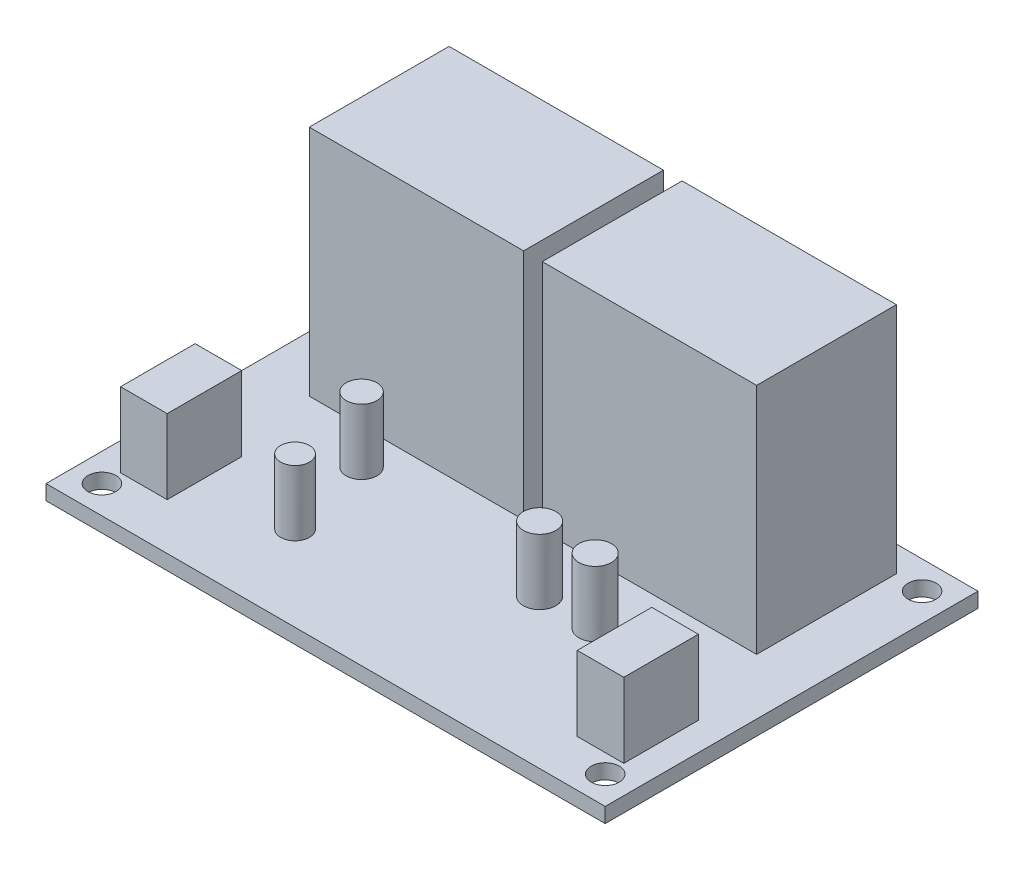
ISO-10303-21;
HEADER;
FILE_DESCRIPTION(('STEP AP214'),'2;1');
FILE_NAME('part.step','',(''),(''),'','','');
FILE_SCHEMA(('AUTOMOTIVE_DESIGN { 1 0 10303 214 1 1 1 1 }'));
ENDSEC;
DATA;
#1=APPLICATION_CONTEXT('core data for automotive mechanical design processes');
#2=APPLICATION_PROTOCOL_DEFINITION('international standard','automotive_design',2000,#1);
#3=PRODUCT_CONTEXT('',#1,'mechanical');
#4=PRODUCT('Part','Part','',(#3));
#5=PRODUCT_RELATED_PRODUCT_CATEGORY('part','',(#4));
#6=PRODUCT_DEFINITION_FORMATION('','',#4);
#7=PRODUCT_DEFINITION_CONTEXT('part definition',#1,'design');
#8=PRODUCT_DEFINITION('design','',#6,#7);
#9=PRODUCT_DEFINITION_SHAPE('','',#8);
#10=(LENGTH_UNIT() NAMED_UNIT(*) SI_UNIT(.MILLI.,.METRE.));
#11=(NAMED_UNIT(*) PLANE_ANGLE_UNIT() SI_UNIT($,.RADIAN.));
#12=(NAMED_UNIT(*) SI_UNIT($,.STERADIAN.) SOLID_ANGLE_UNIT());
#13=UNCERTAINTY_MEASURE_WITH_UNIT(LENGTH_MEASURE(1.E-05),#10,'distance_accuracy_value','');
#14=(GEOMETRIC_REPRESENTATION_CONTEXT(3) GLOBAL_UNCERTAINTY_ASSIGNED_CONTEXT((#13)) GLOBAL_UNIT_ASSIGNED_CONTEXT((#10,
#11,#12)) REPRESENTATION_CONTEXT('',''));
#15=CARTESIAN_POINT('',(0.,0.,0.));
#16=DIRECTION('',(0.,0.,1.));
#17=DIRECTION('',(1.,0.,0.));
#18=AXIS2_PLACEMENT_3D('',#15,#16,#17);
#19=CARTESIAN_POINT('',(0.,1.6,0.));
#20=DIRECTION('',(0.,-1.,0.));
#21=DIRECTION('',(0.,0.,-1.));
#22=AXIS2_PLACEMENT_3D('',#19,#20,#21);
#23=PLANE('',#22);
#24=CARTESIAN_POINT('',(27.,1.6,-17.));
#25=DIRECTION('',(0.,1.,0.));
#26=DIRECTION('',(0.,0.,1.));
#27=AXIS2_PLACEMENT_3D('',#24,#25,#26);
#28=CIRCLE('',#27,1.5);
#29=CARTESIAN_POINT('',(27.,1.6,-15.5));
#30=VERTEX_POINT('',#29);
#31=EDGE_CURVE('E383',#30,#30,#28,.T.);
#32=ORIENTED_EDGE('',*,*,#31,.F.);
#33=EDGE_LOOP('',(#32));
#34=FACE_BOUND('',#33,.T.);
#35=CARTESIAN_POINT('',(27.,1.6,17.));
#36=DIRECTION('',(0.,1.,0.));
#37=DIRECTION('',(0.,0.,1.));
#38=AXIS2_PLACEMENT_3D('',#35,#36,#37);
#39=CIRCLE('',#38,1.5);
#40=CARTESIAN_POINT('',(27.,1.6,18.5));
#41=VERTEX_POINT('',#40);
#42=EDGE_CURVE('E389',#41,#41,#39,.T.);
#43=ORIENTED_EDGE('',*,*,#42,.F.);
#44=EDGE_LOOP('',(#43));
#45=FACE_BOUND('',#44,.T.);
#46=CARTESIAN_POINT('',(-27.,1.6,17.));
#47=DIRECTION('',(0.,1.,0.));
#48=DIRECTION('',(0.,0.,1.));
#49=AXIS2_PLACEMENT_3D('',#46,#47,#48);
#50=CIRCLE('',#49,1.5);
#51=CARTESIAN_POINT('',(-27.,1.6,18.5));
#52=VERTEX_POINT('',#51);
#53=EDGE_CURVE('E377',#52,#52,#50,.T.);
#54=ORIENTED_EDGE('',*,*,#53,.F.);
#55=EDGE_LOOP('',(#54));
#56=FACE_BOUND('',#55,.T.);
#57=CARTESIAN_POINT('',(-27.,1.6,-17.));
#58=DIRECTION('',(0.,1.,0.));
#59=DIRECTION('',(0.,0.,1.));
#60=AXIS2_PLACEMENT_3D('',#57,#58,#59);
#61=CIRCLE('',#60,1.5);
#62=CARTESIAN_POINT('',(-27.,1.6,-15.5));
#63=VERTEX_POINT('',#62);
#64=EDGE_CURVE('E373',#63,#63,#61,.T.);
#65=ORIENTED_EDGE('',*,*,#64,.F.);
#66=EDGE_LOOP('',(#65));
#67=FACE_BOUND('',#66,.T.);
#68=CARTESIAN_POINT('',(12.9238759452155,1.6,3.99818904659685));
#69=DIRECTION('',(0.,-1.,0.));
#70=DIRECTION('',(0.,0.,-1.));
#71=AXIS2_PLACEMENT_3D('',#68,#69,#70);
#72=CIRCLE('',#71,1.75);
#73=CARTESIAN_POINT('',(12.9238759452155,1.6,2.24818904659685));
#74=VERTEX_POINT('',#73);
#75=EDGE_CURVE('E11',#74,#74,#72,.F.);
#76=ORIENTED_EDGE('',*,*,#75,.F.);
#77=EDGE_LOOP('',(#76));
#78=FACE_BOUND('',#77,.T.);
#79=CARTESIAN_POINT('',(-12.4051919607922,1.6,10.8707518402065));
#80=DIRECTION('',(0.,-1.,0.));
#81=DIRECTION('',(0.,0.,-1.));
#82=AXIS2_PLACEMENT_3D('',#79,#80,#81);
#83=CIRCLE('',#82,1.54641686401478);
#84=CARTESIAN_POINT('',(-12.4051919607922,1.6,9.32433497619167));
#85=VERTEX_POINT('',#84);
#86=EDGE_CURVE('E40',#85,#85,#83,.F.);
#87=ORIENTED_EDGE('',*,*,#86,.F.);
#88=EDGE_LOOP('',(#87));
#89=FACE_BOUND('',#88,.T.);
#90=CARTESIAN_POINT('',(6.95901012434683,1.6,3.99818904659685));
#91=DIRECTION('',(0.,-1.,0.));
#92=DIRECTION('',(0.,0.,-1.));
#93=AXIS2_PLACEMENT_3D('',#90,#91,#92);
#94=CIRCLE('',#93,1.75);
#95=CARTESIAN_POINT('',(6.95901012434683,1.6,2.24818904659685));
#96=VERTEX_POINT('',#95);
#97=EDGE_CURVE('E327',#96,#96,#94,.F.);
#98=ORIENTED_EDGE('',*,*,#97,.F.);
#99=EDGE_LOOP('',(#98));
#100=FACE_BOUND('',#99,.T.);
#101=CARTESIAN_POINT('',(-14.6095988945915,1.6,1.53444012058586));
#102=DIRECTION('',(0.,-1.,0.));
#103=DIRECTION('',(0.,0.,-1.));
#104=AXIS2_PLACEMENT_3D('',#101,#102,#103);
#105=CIRCLE('',#104,1.65157393474556);
#106=CARTESIAN_POINT('',(-14.6095988945915,1.6,-0.117133814159701));
#107=VERTEX_POINT('',#106);
#108=EDGE_CURVE('E324',#107,#107,#105,.F.);
#109=ORIENTED_EDGE('',*,*,#108,.F.);
#110=EDGE_LOOP('',(#109));
#111=FACE_BOUND('',#110,.T.);
#112=DIRECTION('',(0.,0.,-1.));
#113=VECTOR('',#112,1.);
#114=CARTESIAN_POINT('',(-22.,1.6,7.));
#115=LINE('',#114,#113);
#116=CARTESIAN_POINT('',(-22.,1.6,15.));
#117=VERTEX_POINT('',#116);
#118=CARTESIAN_POINT('',(-22.,1.6,7.));
#119=VERTEX_POINT('',#118);
#120=EDGE_CURVE('E190',#117,#119,#115,.T.);
#121=ORIENTED_EDGE('',*,*,#120,.F.);
#122=DIRECTION('',(1.,0.,0.));
#123=VECTOR('',#122,1.);
#124=CARTESIAN_POINT('',(-27.,1.6,15.));
#125=LINE('',#124,#123);
#126=CARTESIAN_POINT('',(-27.,1.6,15.));
#127=VERTEX_POINT('',#126);
#128=EDGE_CURVE('E203',#127,#117,#125,.T.);
#129=ORIENTED_EDGE('',*,*,#128,.F.);
#130=DIRECTION('',(0.,0.,1.));
#131=VECTOR('',#130,1.);
#132=CARTESIAN_POINT('',(-27.,1.6,6.99999999999999));
#133=LINE('',#132,#131);
#134=CARTESIAN_POINT('',(-27.,1.6,6.99999999999999));
#135=VERTEX_POINT('',#134);
#136=EDGE_CURVE('E212',#135,#127,#133,.T.);
#137=ORIENTED_EDGE('',*,*,#136,.F.);
#138=DIRECTION('',(-1.,0.,0.));
#139=VECTOR('',#138,1.);
#140=CARTESIAN_POINT('',(-27.,1.6,6.99999999999999));
#141=LINE('',#140,#139);
#142=EDGE_CURVE('E193',#119,#135,#141,.T.);
#143=ORIENTED_EDGE('',*,*,#142,.F.);
#144=EDGE_LOOP('',(#121,#129,#137,#143));
#145=FACE_BOUND('',#144,.T.);
#146=DIRECTION('',(0.,0.,-1.));
#147=VECTOR('',#146,1.);
#148=CARTESIAN_POINT('',(-1.,1.6,-17.2469365406224));
#149=LINE('',#148,#147);
#150=CARTESIAN_POINT('',(-0.999999999999999,1.6,-2.24693654062242));
#151=VERTEX_POINT('',#150);
#152=CARTESIAN_POINT('',(-1.,1.6,-17.2469365406224));
#153=VERTEX_POINT('',#152);
#154=EDGE_CURVE('E261',#151,#153,#149,.T.);
#155=ORIENTED_EDGE('',*,*,#154,.F.);
#156=DIRECTION('',(1.,0.,0.));
#157=VECTOR('',#156,1.);
#158=CARTESIAN_POINT('',(-24.,1.6,-2.24693654062242));
#159=LINE('',#158,#157);
#160=CARTESIAN_POINT('',(-24.,1.6,-2.24693654062242));
#161=VERTEX_POINT('',#160);
#162=EDGE_CURVE('E266',#161,#151,#159,.T.);
#163=ORIENTED_EDGE('',*,*,#162,.F.);
#164=DIRECTION('',(0.,0.,1.));
#165=VECTOR('',#164,1.);
#166=CARTESIAN_POINT('',(-24.,1.6,-17.2469365406224));
#167=LINE('',#166,#165);
#168=CARTESIAN_POINT('',(-24.,1.6,-17.2469365406224));
#169=VERTEX_POINT('',#168);
#170=EDGE_CURVE('E278',#169,#161,#167,.T.);
#171=ORIENTED_EDGE('',*,*,#170,.F.);
#172=DIRECTION('',(-1.,0.,0.));
#173=VECTOR('',#172,1.);
#174=CARTESIAN_POINT('',(-24.,1.6,-17.2469365406224));
#175=LINE('',#174,#173);
#176=EDGE_CURVE('E275',#153,#169,#175,.T.);
#177=ORIENTED_EDGE('',*,*,#176,.F.);
#178=EDGE_LOOP('',(#155,#163,#171,#177));
#179=FACE_BOUND('',#178,.T.);
#180=DIRECTION('',(0.,0.,-1.));
#181=VECTOR('',#180,1.);
#182=CARTESIAN_POINT('',(30.,1.6,20.));
#183=LINE('',#182,#181);
#184=CARTESIAN_POINT('',(30.,1.6,20.));
#185=VERTEX_POINT('',#184);
#186=CARTESIAN_POINT('',(30.,1.6,-20.));
#187=VERTEX_POINT('',#186);
#188=EDGE_CURVE('E295',#185,#187,#183,.T.);
#189=ORIENTED_EDGE('',*,*,#188,.T.);
#190=DIRECTION('',(-1.,0.,0.));
#191=VECTOR('',#190,1.);
#192=CARTESIAN_POINT('',(-30.,1.6,-20.));
#193=LINE('',#192,#191);
#194=CARTESIAN_POINT('',(-30.,1.6,-20.));
#195=VERTEX_POINT('',#194);
#196=EDGE_CURVE('E298',#187,#195,#193,.T.);
#197=ORIENTED_EDGE('',*,*,#196,.T.);
#198=DIRECTION('',(0.,0.,1.));
#199=VECTOR('',#198,1.);
#200=CARTESIAN_POINT('',(-30.,1.6,20.));
#201=LINE('',#200,#199);
#202=CARTESIAN_POINT('',(-30.,1.6,20.));
#203=VERTEX_POINT('',#202);
#204=EDGE_CURVE('E301',#195,#203,#201,.T.);
#205=ORIENTED_EDGE('',*,*,#204,.T.);
#206=DIRECTION('',(1.,0.,0.));
#207=VECTOR('',#206,1.);
#208=CARTESIAN_POINT('',(-30.,1.6,20.));
#209=LINE('',#208,#207);
#210=EDGE_CURVE('E303',#203,#185,#209,.T.);
#211=ORIENTED_EDGE('',*,*,#210,.T.);
#212=EDGE_LOOP('',(#189,#197,#205,#211));
#213=FACE_BOUND('',#212,.T.);
#214=DIRECTION('',(0.,0.,-1.));
#215=VECTOR('',#214,1.);
#216=CARTESIAN_POINT('',(24.,1.6,-17.2469365406224));
#217=LINE('',#216,#215);
#218=CARTESIAN_POINT('',(24.,1.6,-2.24693654062243));
#219=VERTEX_POINT('',#218);
#220=CARTESIAN_POINT('',(24.,1.6,-17.2469365406224));
#221=VERTEX_POINT('',#220);
#222=EDGE_CURVE('E228',#219,#221,#217,.T.);
#223=ORIENTED_EDGE('',*,*,#222,.F.);
#224=DIRECTION('',(1.,0.,0.));
#225=VECTOR('',#224,1.);
#226=CARTESIAN_POINT('',(1.,1.6,-2.24693654062243));
#227=LINE('',#226,#225);
#228=CARTESIAN_POINT('',(1.,1.6,-2.24693654062243));
#229=VERTEX_POINT('',#228);
#230=EDGE_CURVE('E233',#229,#219,#227,.T.);
#231=ORIENTED_EDGE('',*,*,#230,.F.);
#232=DIRECTION('',(0.,0.,1.));
#233=VECTOR('',#232,1.);
#234=CARTESIAN_POINT('',(0.999999999999998,1.6,-17.2469365406224));
#235=LINE('',#234,#233);
#236=CARTESIAN_POINT('',(0.999999999999998,1.6,-17.2469365406224));
#237=VERTEX_POINT('',#236);
#238=EDGE_CURVE('E245',#237,#229,#235,.T.);
#239=ORIENTED_EDGE('',*,*,#238,.F.);
#240=DIRECTION('',(-1.,0.,0.));
#241=VECTOR('',#240,1.);
#242=CARTESIAN_POINT('',(0.999999999999998,1.6,-17.2469365406224));
#243=LINE('',#242,#241);
#244=EDGE_CURVE('E242',#221,#237,#243,.T.);
#245=ORIENTED_EDGE('',*,*,#244,.F.);
#246=EDGE_LOOP('',(#223,#231,#239,#245));
#247=FACE_BOUND('',#246,.T.);
#248=DIRECTION('',(0.,0.,-1.));
#249=VECTOR('',#248,1.);
#250=CARTESIAN_POINT('',(27.,1.6,7.));
#251=LINE('',#250,#249);
#252=CARTESIAN_POINT('',(27.,1.6,15.));
#253=VERTEX_POINT('',#252);
#254=CARTESIAN_POINT('',(27.,1.6,7.));
#255=VERTEX_POINT('',#254);
#256=EDGE_CURVE('E189',#253,#255,#251,.T.);
#257=ORIENTED_EDGE('',*,*,#256,.F.);
#258=DIRECTION('',(1.,0.,0.));
#259=VECTOR('',#258,1.);
#260=CARTESIAN_POINT('',(22.,1.6,15.));
#261=LINE('',#260,#259);
#262=CARTESIAN_POINT('',(22.,1.6,15.));
#263=VERTEX_POINT('',#262);
#264=EDGE_CURVE('E186',#263,#253,#261,.T.);
#265=ORIENTED_EDGE('',*,*,#264,.F.);
#266=DIRECTION('',(0.,0.,1.));
#267=VECTOR('',#266,1.);
#268=CARTESIAN_POINT('',(22.,1.6,7.));
#269=LINE('',#268,#267);
#270=CARTESIAN_POINT('',(22.,1.6,7.));
#271=VERTEX_POINT('',#270);
#272=EDGE_CURVE('E52',#271,#263,#269,.T.);
#273=ORIENTED_EDGE('',*,*,#272,.F.);
#274=DIRECTION('',(-1.,0.,0.));
#275=VECTOR('',#274,1.);
#276=CARTESIAN_POINT('',(22.,1.6,7.));
#277=LINE('',#276,#275);
#278=EDGE_CURVE('E47',#255,#271,#277,.T.);
#279=ORIENTED_EDGE('',*,*,#278,.F.);
#280=EDGE_LOOP('',(#257,#265,#273,#279));
#281=FACE_BOUND('',#280,.T.);
#282=ADVANCED_FACE('F32',(#34,#45,#56,#67,#78,#89,#100,#111,#145,#179,#213,#247,#281),#23,.F.);
#283=CARTESIAN_POINT('',(30.,1.6,20.));
#284=DIRECTION('',(-1.,0.,0.));
#285=DIRECTION('',(0.,0.,1.));
#286=AXIS2_PLACEMENT_3D('',#283,#284,#285);
#287=PLANE('',#286);
#288=DIRECTION('',(0.,0.,-1.));
#289=VECTOR('',#288,1.);
#290=CARTESIAN_POINT('',(30.,0.,20.));
#291=LINE('',#290,#289);
#292=CARTESIAN_POINT('',(30.,0.,20.));
#293=VERTEX_POINT('',#292);
#294=CARTESIAN_POINT('',(30.,0.,-20.));
#295=VERTEX_POINT('',#294);
#296=EDGE_CURVE('E294',#293,#295,#291,.T.);
#297=ORIENTED_EDGE('',*,*,#296,.T.);
#298=DIRECTION('',(0.,-1.,0.));
#299=VECTOR('',#298,1.);
#300=CARTESIAN_POINT('',(30.,1.6,-20.));
#301=LINE('',#300,#299);
#302=EDGE_CURVE('E321',#187,#295,#301,.T.);
#303=ORIENTED_EDGE('',*,*,#302,.F.);
#304=ORIENTED_EDGE('',*,*,#188,.F.);
#305=DIRECTION('',(0.,-1.,0.));
#306=VECTOR('',#305,1.);
#307=CARTESIAN_POINT('',(30.,1.6,20.));
#308=LINE('',#307,#306);
#309=EDGE_CURVE('E305',#185,#293,#308,.T.);
#310=ORIENTED_EDGE('',*,*,#309,.T.);
#311=EDGE_LOOP('',(#297,#303,#304,#310));
#312=FACE_BOUND('',#311,.T.);
#313=ADVANCED_FACE('F34',(#312),#287,.F.);
#314=CARTESIAN_POINT('',(-30.,1.6,-20.));
#315=DIRECTION('',(0.,0.,1.));
#316=DIRECTION('',(1.,0.,0.));
#317=AXIS2_PLACEMENT_3D('',#314,#315,#316);
#318=PLANE('',#317);
#319=DIRECTION('',(-1.,0.,0.));
#320=VECTOR('',#319,1.);
#321=CARTESIAN_POINT('',(-30.,0.,-20.));
#322=LINE('',#321,#320);
#323=CARTESIAN_POINT('',(-30.,0.,-20.));
#324=VERTEX_POINT('',#323);
#325=EDGE_CURVE('E308',#295,#324,#322,.T.);
#326=ORIENTED_EDGE('',*,*,#325,.T.);
#327=DIRECTION('',(0.,-1.,0.));
#328=VECTOR('',#327,1.);
#329=CARTESIAN_POINT('',(-30.,1.6,-20.));
#330=LINE('',#329,#328);
#331=EDGE_CURVE('E318',#195,#324,#330,.T.);
#332=ORIENTED_EDGE('',*,*,#331,.F.);
#333=ORIENTED_EDGE('',*,*,#196,.F.);
#334=ORIENTED_EDGE('',*,*,#302,.T.);
#335=EDGE_LOOP('',(#326,#332,#333,#334));
#336=FACE_BOUND('',#335,.T.);
#337=ADVANCED_FACE('F524',(#336),#318,.F.);
#338=CARTESIAN_POINT('',(-30.,1.6,20.));
#339=DIRECTION('',(1.,0.,0.));
#340=DIRECTION('',(0.,0.,-1.));
#341=AXIS2_PLACEMENT_3D('',#338,#339,#340);
#342=PLANE('',#341);
#343=DIRECTION('',(0.,0.,1.));
#344=VECTOR('',#343,1.);
#345=CARTESIAN_POINT('',(-30.,0.,20.));
#346=LINE('',#345,#344);
#347=CARTESIAN_POINT('',(-30.,0.,20.));
#348=VERTEX_POINT('',#347);
#349=EDGE_CURVE('E310',#324,#348,#346,.T.);
#350=ORIENTED_EDGE('',*,*,#349,.T.);
#351=DIRECTION('',(0.,-1.,0.));
#352=VECTOR('',#351,1.);
#353=CARTESIAN_POINT('',(-30.,1.6,20.));
#354=LINE('',#353,#352);
#355=EDGE_CURVE('E315',#203,#348,#354,.T.);
#356=ORIENTED_EDGE('',*,*,#355,.F.);
#357=ORIENTED_EDGE('',*,*,#204,.F.);
#358=ORIENTED_EDGE('',*,*,#331,.T.);
#359=EDGE_LOOP('',(#350,#356,#357,#358));
#360=FACE_BOUND('',#359,.T.);
#361=ADVANCED_FACE('F521',(#360),#342,.F.);
#362=CARTESIAN_POINT('',(-30.,1.6,20.));
#363=DIRECTION('',(0.,0.,-1.));
#364=DIRECTION('',(-1.,0.,0.));
#365=AXIS2_PLACEMENT_3D('',#362,#363,#364);
#366=PLANE('',#365);
#367=DIRECTION('',(1.,0.,0.));
#368=VECTOR('',#367,1.);
#369=CARTESIAN_POINT('',(-30.,0.,20.));
#370=LINE('',#369,#368);
#371=EDGE_CURVE('E299',#348,#293,#370,.T.);
#372=ORIENTED_EDGE('',*,*,#371,.T.);
#373=ORIENTED_EDGE('',*,*,#309,.F.);
#374=ORIENTED_EDGE('',*,*,#210,.F.);
#375=ORIENTED_EDGE('',*,*,#355,.T.);
#376=EDGE_LOOP('',(#372,#373,#374,#375));
#377=FACE_BOUND('',#376,.T.);
#378=ADVANCED_FACE('F517',(#377),#366,.F.);
#379=CARTESIAN_POINT('',(0.,0.,0.));
#380=DIRECTION('',(0.,-1.,0.));
#381=DIRECTION('',(0.,0.,-1.));
#382=AXIS2_PLACEMENT_3D('',#379,#380,#381);
#383=PLANE('',#382);
#384=CARTESIAN_POINT('',(27.,0.,-17.));
#385=DIRECTION('',(0.,-1.,0.));
#386=DIRECTION('',(0.,0.,-1.));
#387=AXIS2_PLACEMENT_3D('',#384,#385,#386);
#388=CIRCLE('',#387,1.5);
#389=CARTESIAN_POINT('',(27.,0.,-18.5));
#390=VERTEX_POINT('',#389);
#391=EDGE_CURVE('E380',#390,#390,#388,.F.);
#392=ORIENTED_EDGE('',*,*,#391,.T.);
#393=EDGE_LOOP('',(#392));
#394=FACE_BOUND('',#393,.T.);
#395=CARTESIAN_POINT('',(27.,0.,17.));
#396=DIRECTION('',(0.,-1.,0.));
#397=DIRECTION('',(0.,0.,-1.));
#398=AXIS2_PLACEMENT_3D('',#395,#396,#397);
#399=CIRCLE('',#398,1.5);
#400=CARTESIAN_POINT('',(27.,0.,15.5));
#401=VERTEX_POINT('',#400);
#402=EDGE_CURVE('E386',#401,#401,#399,.F.);
#403=ORIENTED_EDGE('',*,*,#402,.T.);
#404=EDGE_LOOP('',(#403));
#405=FACE_BOUND('',#404,.T.);
#406=CARTESIAN_POINT('',(-27.,0.,17.));
#407=DIRECTION('',(0.,-1.,0.));
#408=DIRECTION('',(0.,0.,-1.));
#409=AXIS2_PLACEMENT_3D('',#406,#407,#408);
#410=CIRCLE('',#409,1.5);
#411=CARTESIAN_POINT('',(-27.,0.,15.5));
#412=VERTEX_POINT('',#411);
#413=EDGE_CURVE('E392',#412,#412,#410,.F.);
#414=ORIENTED_EDGE('',*,*,#413,.T.);
#415=EDGE_LOOP('',(#414));
#416=FACE_BOUND('',#415,.T.);
#417=CARTESIAN_POINT('',(-27.,0.,-17.));
#418=DIRECTION('',(0.,-1.,0.));
#419=DIRECTION('',(0.,0.,-1.));
#420=AXIS2_PLACEMENT_3D('',#417,#418,#419);
#421=CIRCLE('',#420,1.5);
#422=CARTESIAN_POINT('',(-27.,0.,-18.5));
#423=VERTEX_POINT('',#422);
#424=EDGE_CURVE('E374',#423,#423,#421,.F.);
#425=ORIENTED_EDGE('',*,*,#424,.T.);
#426=EDGE_LOOP('',(#425));
#427=FACE_BOUND('',#426,.T.);
#428=ORIENTED_EDGE('',*,*,#296,.F.);
#429=ORIENTED_EDGE('',*,*,#371,.F.);
#430=ORIENTED_EDGE('',*,*,#349,.F.);
#431=ORIENTED_EDGE('',*,*,#325,.F.);
#432=EDGE_LOOP('',(#428,#429,#430,#431));
#433=FACE_BOUND('',#432,.T.);
#434=ADVANCED_FACE('F512',(#394,#405,#416,#427,#433),#383,.T.);
#435=CARTESIAN_POINT('',(-1.,26.6,-17.2469365406224));
#436=DIRECTION('',(-1.,0.,0.));
#437=DIRECTION('',(0.,0.,1.));
#438=AXIS2_PLACEMENT_3D('',#435,#436,#437);
#439=PLANE('',#438);
#440=ORIENTED_EDGE('',*,*,#154,.T.);
#441=DIRECTION('',(0.,-1.,0.));
#442=VECTOR('',#441,1.);
#443=CARTESIAN_POINT('',(-1.,26.6,-17.2469365406224));
#444=LINE('',#443,#442);
#445=CARTESIAN_POINT('',(-1.,26.6,-17.2469365406224));
#446=VERTEX_POINT('',#445);
#447=EDGE_CURVE('E291',#446,#153,#444,.T.);
#448=ORIENTED_EDGE('',*,*,#447,.F.);
#449=DIRECTION('',(0.,0.,-1.));
#450=VECTOR('',#449,1.);
#451=CARTESIAN_POINT('',(-1.,26.6,-17.2469365406224));
#452=LINE('',#451,#450);
#453=CARTESIAN_POINT('',(-0.999999999999999,26.6,-2.24693654062242));
#454=VERTEX_POINT('',#453);
#455=EDGE_CURVE('E262',#454,#446,#452,.T.);
#456=ORIENTED_EDGE('',*,*,#455,.F.);
#457=DIRECTION('',(0.,-1.,0.));
#458=VECTOR('',#457,1.);
#459=CARTESIAN_POINT('',(-0.999999999999999,26.6,-2.24693654062242));
#460=LINE('',#459,#458);
#461=EDGE_CURVE('E272',#454,#151,#460,.T.);
#462=ORIENTED_EDGE('',*,*,#461,.T.);
#463=EDGE_LOOP('',(#440,#448,#456,#462));
#464=FACE_BOUND('',#463,.T.);
#465=ADVANCED_FACE('F509',(#464),#439,.F.);
#466=CARTESIAN_POINT('',(-24.,26.6,-17.2469365406224));
#467=DIRECTION('',(0.,0.,1.));
#468=DIRECTION('',(1.,0.,0.));
#469=AXIS2_PLACEMENT_3D('',#466,#467,#468);
#470=PLANE('',#469);
#471=ORIENTED_EDGE('',*,*,#176,.T.);
#472=DIRECTION('',(0.,-1.,0.));
#473=VECTOR('',#472,1.);
#474=CARTESIAN_POINT('',(-24.,26.6,-17.2469365406224));
#475=LINE('',#474,#473);
#476=CARTESIAN_POINT('',(-24.,26.6,-17.2469365406224));
#477=VERTEX_POINT('',#476);
#478=EDGE_CURVE('E288',#477,#169,#475,.T.);
#479=ORIENTED_EDGE('',*,*,#478,.F.);
#480=DIRECTION('',(-1.,0.,0.));
#481=VECTOR('',#480,1.);
#482=CARTESIAN_POINT('',(-24.,26.6,-17.2469365406224));
#483=LINE('',#482,#481);
#484=EDGE_CURVE('E265',#446,#477,#483,.T.);
#485=ORIENTED_EDGE('',*,*,#484,.F.);
#486=ORIENTED_EDGE('',*,*,#447,.T.);
#487=EDGE_LOOP('',(#471,#479,#485,#486));
#488=FACE_BOUND('',#487,.T.);
#489=ADVANCED_FACE('F505',(#488),#470,.F.);
#490=CARTESIAN_POINT('',(-24.,26.6,-17.2469365406224));
#491=DIRECTION('',(1.,0.,0.));
#492=DIRECTION('',(0.,0.,-1.));
#493=AXIS2_PLACEMENT_3D('',#490,#491,#492);
#494=PLANE('',#493);
#495=ORIENTED_EDGE('',*,*,#170,.T.);
#496=DIRECTION('',(0.,-1.,0.));
#497=VECTOR('',#496,1.);
#498=CARTESIAN_POINT('',(-24.,26.6,-2.24693654062242));
#499=LINE('',#498,#497);
#500=CARTESIAN_POINT('',(-24.,26.6,-2.24693654062242));
#501=VERTEX_POINT('',#500);
#502=EDGE_CURVE('E285',#501,#161,#499,.T.);
#503=ORIENTED_EDGE('',*,*,#502,.F.);
#504=DIRECTION('',(0.,0.,1.));
#505=VECTOR('',#504,1.);
#506=CARTESIAN_POINT('',(-24.,26.6,-17.2469365406224));
#507=LINE('',#506,#505);
#508=EDGE_CURVE('E268',#477,#501,#507,.T.);
#509=ORIENTED_EDGE('',*,*,#508,.F.);
#510=ORIENTED_EDGE('',*,*,#478,.T.);
#511=EDGE_LOOP('',(#495,#503,#509,#510));
#512=FACE_BOUND('',#511,.T.);
#513=ADVANCED_FACE('F501',(#512),#494,.F.);
#514=CARTESIAN_POINT('',(-24.,26.6,-2.24693654062242));
#515=DIRECTION('',(0.,0.,-1.));
#516=DIRECTION('',(-1.,0.,0.));
#517=AXIS2_PLACEMENT_3D('',#514,#515,#516);
#518=PLANE('',#517);
#519=ORIENTED_EDGE('',*,*,#162,.T.);
#520=ORIENTED_EDGE('',*,*,#461,.F.);
#521=DIRECTION('',(1.,0.,0.));
#522=VECTOR('',#521,1.);
#523=CARTESIAN_POINT('',(-24.,26.6,-2.24693654062242));
#524=LINE('',#523,#522);
#525=EDGE_CURVE('E270',#501,#454,#524,.T.);
#526=ORIENTED_EDGE('',*,*,#525,.F.);
#527=ORIENTED_EDGE('',*,*,#502,.T.);
#528=EDGE_LOOP('',(#519,#520,#526,#527));
#529=FACE_BOUND('',#528,.T.);
#530=ADVANCED_FACE('F497',(#529),#518,.F.);
#531=CARTESIAN_POINT('',(0.,26.6,0.));
#532=DIRECTION('',(0.,1.,0.));
#533=DIRECTION('',(0.,0.,1.));
#534=AXIS2_PLACEMENT_3D('',#531,#532,#533);
#535=PLANE('',#534);
#536=ORIENTED_EDGE('',*,*,#455,.T.);
#537=ORIENTED_EDGE('',*,*,#484,.T.);
#538=ORIENTED_EDGE('',*,*,#508,.T.);
#539=ORIENTED_EDGE('',*,*,#525,.T.);
#540=EDGE_LOOP('',(#536,#537,#538,#539));
#541=FACE_BOUND('',#540,.T.);
#542=ADVANCED_FACE('F493',(#541),#535,.T.);
#543=CARTESIAN_POINT('',(24.,26.6,-17.2469365406224));
#544=DIRECTION('',(-1.,0.,0.));
#545=DIRECTION('',(0.,0.,1.));
#546=AXIS2_PLACEMENT_3D('',#543,#544,#545);
#547=PLANE('',#546);
#548=ORIENTED_EDGE('',*,*,#222,.T.);
#549=DIRECTION('',(0.,-1.,0.));
#550=VECTOR('',#549,1.);
#551=CARTESIAN_POINT('',(24.,26.6,-17.2469365406224));
#552=LINE('',#551,#550);
#553=CARTESIAN_POINT('',(24.,26.6,-17.2469365406224));
#554=VERTEX_POINT('',#553);
#555=EDGE_CURVE('E258',#554,#221,#552,.T.);
#556=ORIENTED_EDGE('',*,*,#555,.F.);
#557=DIRECTION('',(0.,0.,-1.));
#558=VECTOR('',#557,1.);
#559=CARTESIAN_POINT('',(24.,26.6,-17.2469365406224));
#560=LINE('',#559,#558);
#561=CARTESIAN_POINT('',(24.,26.6,-2.24693654062243));
#562=VERTEX_POINT('',#561);
#563=EDGE_CURVE('E229',#562,#554,#560,.T.);
#564=ORIENTED_EDGE('',*,*,#563,.F.);
#565=DIRECTION('',(0.,-1.,0.));
#566=VECTOR('',#565,1.);
#567=CARTESIAN_POINT('',(24.,26.6,-2.24693654062243));
#568=LINE('',#567,#566);
#569=EDGE_CURVE('E239',#562,#219,#568,.T.);
#570=ORIENTED_EDGE('',*,*,#569,.T.);
#571=EDGE_LOOP('',(#548,#556,#564,#570));
#572=FACE_BOUND('',#571,.T.);
#573=ADVANCED_FACE('F489',(#572),#547,.F.);
#574=CARTESIAN_POINT('',(0.999999999999998,26.6,-17.2469365406224));
#575=DIRECTION('',(0.,0.,1.));
#576=DIRECTION('',(1.,0.,0.));
#577=AXIS2_PLACEMENT_3D('',#574,#575,#576);
#578=PLANE('',#577);
#579=ORIENTED_EDGE('',*,*,#244,.T.);
#580=DIRECTION('',(0.,-1.,0.));
#581=VECTOR('',#580,1.);
#582=CARTESIAN_POINT('',(0.999999999999998,26.6,-17.2469365406224));
#583=LINE('',#582,#581);
#584=CARTESIAN_POINT('',(0.999999999999998,26.6,-17.2469365406224));
#585=VERTEX_POINT('',#584);
#586=EDGE_CURVE('E255',#585,#237,#583,.T.);
#587=ORIENTED_EDGE('',*,*,#586,.F.);
#588=DIRECTION('',(-1.,0.,0.));
#589=VECTOR('',#588,1.);
#590=CARTESIAN_POINT('',(0.999999999999998,26.6,-17.2469365406224));
#591=LINE('',#590,#589);
#592=EDGE_CURVE('E232',#554,#585,#591,.T.);
#593=ORIENTED_EDGE('',*,*,#592,.F.);
#594=ORIENTED_EDGE('',*,*,#555,.T.);
#595=EDGE_LOOP('',(#579,#587,#593,#594));
#596=FACE_BOUND('',#595,.T.);
#597=ADVANCED_FACE('F485',(#596),#578,.F.);
#598=CARTESIAN_POINT('',(0.999999999999998,26.6,-17.2469365406224));
#599=DIRECTION('',(1.,0.,0.));
#600=DIRECTION('',(0.,0.,-1.));
#601=AXIS2_PLACEMENT_3D('',#598,#599,#600);
#602=PLANE('',#601);
#603=ORIENTED_EDGE('',*,*,#238,.T.);
#604=DIRECTION('',(0.,-1.,0.));
#605=VECTOR('',#604,1.);
#606=CARTESIAN_POINT('',(1.,26.6,-2.24693654062243));
#607=LINE('',#606,#605);
#608=CARTESIAN_POINT('',(1.,26.6,-2.24693654062243));
#609=VERTEX_POINT('',#608);
#610=EDGE_CURVE('E252',#609,#229,#607,.T.);
#611=ORIENTED_EDGE('',*,*,#610,.F.);
#612=DIRECTION('',(0.,0.,1.));
#613=VECTOR('',#612,1.);
#614=CARTESIAN_POINT('',(0.999999999999998,26.6,-17.2469365406224));
#615=LINE('',#614,#613);
#616=EDGE_CURVE('E235',#585,#609,#615,.T.);
#617=ORIENTED_EDGE('',*,*,#616,.F.);
#618=ORIENTED_EDGE('',*,*,#586,.T.);
#619=EDGE_LOOP('',(#603,#611,#617,#618));
#620=FACE_BOUND('',#619,.T.);
#621=ADVANCED_FACE('F481',(#620),#602,.F.);
#622=CARTESIAN_POINT('',(1.,26.6,-2.24693654062243));
#623=DIRECTION('',(0.,0.,-1.));
#624=DIRECTION('',(-1.,0.,0.));
#625=AXIS2_PLACEMENT_3D('',#622,#623,#624);
#626=PLANE('',#625);
#627=ORIENTED_EDGE('',*,*,#230,.T.);
#628=ORIENTED_EDGE('',*,*,#569,.F.);
#629=DIRECTION('',(1.,0.,0.));
#630=VECTOR('',#629,1.);
#631=CARTESIAN_POINT('',(1.,26.6,-2.24693654062243));
#632=LINE('',#631,#630);
#633=EDGE_CURVE('E237',#609,#562,#632,.T.);
#634=ORIENTED_EDGE('',*,*,#633,.F.);
#635=ORIENTED_EDGE('',*,*,#610,.T.);
#636=EDGE_LOOP('',(#627,#628,#634,#635));
#637=FACE_BOUND('',#636,.T.);
#638=ADVANCED_FACE('F477',(#637),#626,.F.);
#639=CARTESIAN_POINT('',(0.,26.6,0.));
#640=DIRECTION('',(0.,1.,0.));
#641=DIRECTION('',(0.,0.,1.));
#642=AXIS2_PLACEMENT_3D('',#639,#640,#641);
#643=PLANE('',#642);
#644=ORIENTED_EDGE('',*,*,#563,.T.);
#645=ORIENTED_EDGE('',*,*,#592,.T.);
#646=ORIENTED_EDGE('',*,*,#616,.T.);
#647=ORIENTED_EDGE('',*,*,#633,.T.);
#648=EDGE_LOOP('',(#644,#645,#646,#647));
#649=FACE_BOUND('',#648,.T.);
#650=ADVANCED_FACE('F473',(#649),#643,.T.);
#651=CARTESIAN_POINT('',(-22.,9.6,7.));
#652=DIRECTION('',(-1.,0.,0.));
#653=DIRECTION('',(0.,0.,1.));
#654=AXIS2_PLACEMENT_3D('',#651,#652,#653);
#655=PLANE('',#654);
#656=ORIENTED_EDGE('',*,*,#120,.T.);
#657=DIRECTION('',(0.,-1.,0.));
#658=VECTOR('',#657,1.);
#659=CARTESIAN_POINT('',(-22.,9.6,7.));
#660=LINE('',#659,#658);
#661=CARTESIAN_POINT('',(-22.,9.6,7.));
#662=VERTEX_POINT('',#661);
#663=EDGE_CURVE('E225',#662,#119,#660,.T.);
#664=ORIENTED_EDGE('',*,*,#663,.F.);
#665=DIRECTION('',(0.,0.,-1.));
#666=VECTOR('',#665,1.);
#667=CARTESIAN_POINT('',(-22.,9.6,7.));
#668=LINE('',#667,#666);
#669=CARTESIAN_POINT('',(-22.,9.6,15.));
#670=VERTEX_POINT('',#669);
#671=EDGE_CURVE('E199',#670,#662,#668,.T.);
#672=ORIENTED_EDGE('',*,*,#671,.F.);
#673=DIRECTION('',(0.,-1.,0.));
#674=VECTOR('',#673,1.);
#675=CARTESIAN_POINT('',(-22.,9.6,15.));
#676=LINE('',#675,#674);
#677=EDGE_CURVE('E208',#670,#117,#676,.T.);
#678=ORIENTED_EDGE('',*,*,#677,.T.);
#679=EDGE_LOOP('',(#656,#664,#672,#678));
#680=FACE_BOUND('',#679,.T.);
#681=ADVANCED_FACE('F469',(#680),#655,.F.);
#682=CARTESIAN_POINT('',(-27.,9.6,6.99999999999999));
#683=DIRECTION('',(0.,0.,1.));
#684=DIRECTION('',(1.,0.,0.));
#685=AXIS2_PLACEMENT_3D('',#682,#683,#684);
#686=PLANE('',#685);
#687=ORIENTED_EDGE('',*,*,#142,.T.);
#688=DIRECTION('',(0.,-1.,0.));
#689=VECTOR('',#688,1.);
#690=CARTESIAN_POINT('',(-27.,9.6,6.99999999999999));
#691=LINE('',#690,#689);
#692=CARTESIAN_POINT('',(-27.,9.6,6.99999999999999));
#693=VERTEX_POINT('',#692);
#694=EDGE_CURVE('E222',#693,#135,#691,.T.);
#695=ORIENTED_EDGE('',*,*,#694,.F.);
#696=DIRECTION('',(-1.,0.,0.));
#697=VECTOR('',#696,1.);
#698=CARTESIAN_POINT('',(-27.,9.6,6.99999999999999));
#699=LINE('',#698,#697);
#700=EDGE_CURVE('E202',#662,#693,#699,.T.);
#701=ORIENTED_EDGE('',*,*,#700,.F.);
#702=ORIENTED_EDGE('',*,*,#663,.T.);
#703=EDGE_LOOP('',(#687,#695,#701,#702));
#704=FACE_BOUND('',#703,.T.);
#705=ADVANCED_FACE('F465',(#704),#686,.F.);
#706=CARTESIAN_POINT('',(-27.,9.6,6.99999999999999));
#707=DIRECTION('',(1.,0.,0.));
#708=DIRECTION('',(0.,0.,-1.));
#709=AXIS2_PLACEMENT_3D('',#706,#707,#708);
#710=PLANE('',#709);
#711=ORIENTED_EDGE('',*,*,#136,.T.);
#712=DIRECTION('',(0.,-1.,0.));
#713=VECTOR('',#712,1.);
#714=CARTESIAN_POINT('',(-27.,9.6,15.));
#715=LINE('',#714,#713);
#716=CARTESIAN_POINT('',(-27.,9.6,15.));
#717=VERTEX_POINT('',#716);
#718=EDGE_CURVE('E219',#717,#127,#715,.T.);
#719=ORIENTED_EDGE('',*,*,#718,.F.);
#720=DIRECTION('',(0.,0.,1.));
#721=VECTOR('',#720,1.);
#722=CARTESIAN_POINT('',(-27.,9.6,6.99999999999999));
#723=LINE('',#722,#721);
#724=EDGE_CURVE('E205',#693,#717,#723,.T.);
#725=ORIENTED_EDGE('',*,*,#724,.F.);
#726=ORIENTED_EDGE('',*,*,#694,.T.);
#727=EDGE_LOOP('',(#711,#719,#725,#726));
#728=FACE_BOUND('',#727,.T.);
#729=ADVANCED_FACE('F461',(#728),#710,.F.);
#730=CARTESIAN_POINT('',(-27.,9.6,15.));
#731=DIRECTION('',(0.,0.,-1.));
#732=DIRECTION('',(-1.,0.,0.));
#733=AXIS2_PLACEMENT_3D('',#730,#731,#732);
#734=PLANE('',#733);
#735=ORIENTED_EDGE('',*,*,#128,.T.);
#736=ORIENTED_EDGE('',*,*,#677,.F.);
#737=DIRECTION('',(1.,0.,0.));
#738=VECTOR('',#737,1.);
#739=CARTESIAN_POINT('',(-27.,9.6,15.));
#740=LINE('',#739,#738);
#741=EDGE_CURVE('E207',#717,#670,#740,.T.);
#742=ORIENTED_EDGE('',*,*,#741,.F.);
#743=ORIENTED_EDGE('',*,*,#718,.T.);
#744=EDGE_LOOP('',(#735,#736,#742,#743));
#745=FACE_BOUND('',#744,.T.);
#746=ADVANCED_FACE('F457',(#745),#734,.F.);
#747=CARTESIAN_POINT('',(0.,9.6,0.));
#748=DIRECTION('',(0.,1.,0.));
#749=DIRECTION('',(0.,0.,1.));
#750=AXIS2_PLACEMENT_3D('',#747,#748,#749);
#751=PLANE('',#750);
#752=ORIENTED_EDGE('',*,*,#671,.T.);
#753=ORIENTED_EDGE('',*,*,#700,.T.);
#754=ORIENTED_EDGE('',*,*,#724,.T.);
#755=ORIENTED_EDGE('',*,*,#741,.T.);
#756=EDGE_LOOP('',(#752,#753,#754,#755));
#757=FACE_BOUND('',#756,.T.);
#758=ADVANCED_FACE('F454',(#757),#751,.T.);
#759=CARTESIAN_POINT('',(27.,9.6,7.));
#760=DIRECTION('',(-1.,0.,0.));
#761=DIRECTION('',(0.,0.,1.));
#762=AXIS2_PLACEMENT_3D('',#759,#760,#761);
#763=PLANE('',#762);
#764=ORIENTED_EDGE('',*,*,#256,.T.);
#765=DIRECTION('',(0.,-1.,0.));
#766=VECTOR('',#765,1.);
#767=CARTESIAN_POINT('',(27.,9.6,7.));
#768=LINE('',#767,#766);
#769=CARTESIAN_POINT('',(27.,9.6,7.));
#770=VERTEX_POINT('',#769);
#771=EDGE_CURVE('E170',#770,#255,#768,.T.);
#772=ORIENTED_EDGE('',*,*,#771,.F.);
#773=DIRECTION('',(0.,0.,-1.));
#774=VECTOR('',#773,1.);
#775=CARTESIAN_POINT('',(27.,9.6,7.));
#776=LINE('',#775,#774);
#777=CARTESIAN_POINT('',(27.,9.6,15.));
#778=VERTEX_POINT('',#777);
#779=EDGE_CURVE('E177',#778,#770,#776,.T.);
#780=ORIENTED_EDGE('',*,*,#779,.F.);
#781=DIRECTION('',(0.,-1.,0.));
#782=VECTOR('',#781,1.);
#783=CARTESIAN_POINT('',(27.,9.6,15.));
#784=LINE('',#783,#782);
#785=EDGE_CURVE('E353',#778,#253,#784,.T.);
#786=ORIENTED_EDGE('',*,*,#785,.T.);
#787=EDGE_LOOP('',(#764,#772,#780,#786));
#788=FACE_BOUND('',#787,.T.);
#789=ADVANCED_FACE('F188',(#788),#763,.F.);
#790=CARTESIAN_POINT('',(22.,9.6,7.));
#791=DIRECTION('',(0.,0.,1.));
#792=DIRECTION('',(1.,0.,0.));
#793=AXIS2_PLACEMENT_3D('',#790,#791,#792);
#794=PLANE('',#793);
#795=ORIENTED_EDGE('',*,*,#278,.T.);
#796=DIRECTION('',(0.,-1.,0.));
#797=VECTOR('',#796,1.);
#798=CARTESIAN_POINT('',(22.,9.6,7.));
#799=LINE('',#798,#797);
#800=CARTESIAN_POINT('',(22.,9.6,7.));
#801=VERTEX_POINT('',#800);
#802=EDGE_CURVE('E173',#801,#271,#799,.T.);
#803=ORIENTED_EDGE('',*,*,#802,.F.);
#804=DIRECTION('',(-1.,0.,0.));
#805=VECTOR('',#804,1.);
#806=CARTESIAN_POINT('',(22.,9.6,7.));
#807=LINE('',#806,#805);
#808=EDGE_CURVE('E166',#770,#801,#807,.T.);
#809=ORIENTED_EDGE('',*,*,#808,.F.);
#810=ORIENTED_EDGE('',*,*,#771,.T.);
#811=EDGE_LOOP('',(#795,#803,#809,#810));
#812=FACE_BOUND('',#811,.T.);
#813=ADVANCED_FACE('F168',(#812),#794,.F.);
#814=CARTESIAN_POINT('',(22.,9.6,7.));
#815=DIRECTION('',(1.,0.,0.));
#816=DIRECTION('',(0.,0.,-1.));
#817=AXIS2_PLACEMENT_3D('',#814,#815,#816);
#818=PLANE('',#817);
#819=ORIENTED_EDGE('',*,*,#272,.T.);
#820=DIRECTION('',(0.,-1.,0.));
#821=VECTOR('',#820,1.);
#822=CARTESIAN_POINT('',(22.,9.6,15.));
#823=LINE('',#822,#821);
#824=CARTESIAN_POINT('',(22.,9.6,15.));
#825=VERTEX_POINT('',#824);
#826=EDGE_CURVE('E195',#825,#263,#823,.T.);
#827=ORIENTED_EDGE('',*,*,#826,.F.);
#828=DIRECTION('',(0.,0.,1.));
#829=VECTOR('',#828,1.);
#830=CARTESIAN_POINT('',(22.,9.6,7.));
#831=LINE('',#830,#829);
#832=EDGE_CURVE('E176',#801,#825,#831,.T.);
#833=ORIENTED_EDGE('',*,*,#832,.F.);
#834=ORIENTED_EDGE('',*,*,#802,.T.);
#835=EDGE_LOOP('',(#819,#827,#833,#834));
#836=FACE_BOUND('',#835,.T.);
#837=ADVANCED_FACE('F446',(#836),#818,.F.);
#838=CARTESIAN_POINT('',(22.,9.6,15.));
#839=DIRECTION('',(0.,0.,-1.));
#840=DIRECTION('',(-1.,0.,0.));
#841=AXIS2_PLACEMENT_3D('',#838,#839,#840);
#842=PLANE('',#841);
#843=ORIENTED_EDGE('',*,*,#264,.T.);
#844=ORIENTED_EDGE('',*,*,#785,.F.);
#845=DIRECTION('',(1.,0.,0.));
#846=VECTOR('',#845,1.);
#847=CARTESIAN_POINT('',(22.,9.6,15.));
#848=LINE('',#847,#846);
#849=EDGE_CURVE('E182',#825,#778,#848,.T.);
#850=ORIENTED_EDGE('',*,*,#849,.F.);
#851=ORIENTED_EDGE('',*,*,#826,.T.);
#852=EDGE_LOOP('',(#843,#844,#850,#851));
#853=FACE_BOUND('',#852,.T.);
#854=ADVANCED_FACE('F352',(#853),#842,.F.);
#855=CARTESIAN_POINT('',(0.,9.6,0.));
#856=DIRECTION('',(0.,1.,0.));
#857=DIRECTION('',(0.,0.,1.));
#858=AXIS2_PLACEMENT_3D('',#855,#856,#857);
#859=PLANE('',#858);
#860=ORIENTED_EDGE('',*,*,#779,.T.);
#861=ORIENTED_EDGE('',*,*,#808,.T.);
#862=ORIENTED_EDGE('',*,*,#832,.T.);
#863=ORIENTED_EDGE('',*,*,#849,.T.);
#864=EDGE_LOOP('',(#860,#861,#862,#863));
#865=FACE_BOUND('',#864,.T.);
#866=ADVANCED_FACE('F180',(#865),#859,.T.);
#867=CARTESIAN_POINT('',(-14.6095988945915,8.6,1.53444012058586));
#868=DIRECTION('',(0.,-1.,0.));
#869=DIRECTION('',(0.,0.,-1.));
#870=AXIS2_PLACEMENT_3D('',#867,#868,#869);
#871=CYLINDRICAL_SURFACE('',#870,1.65157393474556);
#872=CARTESIAN_POINT('',(-14.6095988945915,8.6,1.53444012058586));
#873=DIRECTION('',(0.,1.,0.));
#874=DIRECTION('',(0.,0.,1.));
#875=AXIS2_PLACEMENT_3D('',#872,#873,#874);
#876=CIRCLE('',#875,1.65157393474556);
#877=CARTESIAN_POINT('',(-14.6095988945915,8.6,3.18601405533143));
#878=VERTEX_POINT('',#877);
#879=EDGE_CURVE('E348',#878,#878,#876,.T.);
#880=ORIENTED_EDGE('',*,*,#879,.F.);
#881=EDGE_LOOP('',(#880));
#882=FACE_BOUND('',#881,.T.);
#883=ORIENTED_EDGE('',*,*,#108,.T.);
#884=EDGE_LOOP('',(#883));
#885=FACE_BOUND('',#884,.T.);
#886=ADVANCED_FACE('F437',(#882,#885),#871,.T.);
#887=CARTESIAN_POINT('',(-14.6095988945915,8.6,1.53444012058586));
#888=DIRECTION('',(0.,1.,0.));
#889=DIRECTION('',(0.,0.,1.));
#890=AXIS2_PLACEMENT_3D('',#887,#888,#889);
#891=PLANE('',#890);
#892=ORIENTED_EDGE('',*,*,#879,.T.);
#893=EDGE_LOOP('',(#892));
#894=FACE_BOUND('',#893,.T.);
#895=ADVANCED_FACE('F433',(#894),#891,.T.);
#896=CARTESIAN_POINT('',(6.95901012434683,8.6,3.99818904659685));
#897=DIRECTION('',(0.,-1.,0.));
#898=DIRECTION('',(0.,0.,-1.));
#899=AXIS2_PLACEMENT_3D('',#896,#897,#898);
#900=CYLINDRICAL_SURFACE('',#899,1.75);
#901=CARTESIAN_POINT('',(6.95901012434683,8.6,3.99818904659685));
#902=DIRECTION('',(0.,1.,0.));
#903=DIRECTION('',(0.,0.,1.));
#904=AXIS2_PLACEMENT_3D('',#901,#902,#903);
#905=CIRCLE('',#904,1.75);
#906=CARTESIAN_POINT('',(6.95901012434683,8.6,5.74818904659685));
#907=VERTEX_POINT('',#906);
#908=EDGE_CURVE('E364',#907,#907,#905,.T.);
#909=ORIENTED_EDGE('',*,*,#908,.F.);
#910=EDGE_LOOP('',(#909));
#911=FACE_BOUND('',#910,.T.);
#912=ORIENTED_EDGE('',*,*,#97,.T.);
#913=EDGE_LOOP('',(#912));
#914=FACE_BOUND('',#913,.T.);
#915=ADVANCED_FACE('F429',(#911,#914),#900,.T.);
#916=CARTESIAN_POINT('',(6.95901012434683,8.6,3.99818904659685));
#917=DIRECTION('',(0.,1.,0.));
#918=DIRECTION('',(0.,0.,1.));
#919=AXIS2_PLACEMENT_3D('',#916,#917,#918);
#920=PLANE('',#919);
#921=ORIENTED_EDGE('',*,*,#908,.T.);
#922=EDGE_LOOP('',(#921));
#923=FACE_BOUND('',#922,.T.);
#924=ADVANCED_FACE('F425',(#923),#920,.T.);
#925=CARTESIAN_POINT('',(-12.4051919607922,8.6,10.8707518402065));
#926=DIRECTION('',(0.,-1.,0.));
#927=DIRECTION('',(0.,0.,-1.));
#928=AXIS2_PLACEMENT_3D('',#925,#926,#927);
#929=CYLINDRICAL_SURFACE('',#928,1.54641686401478);
#930=CARTESIAN_POINT('',(-12.4051919607922,8.6,10.8707518402065));
#931=DIRECTION('',(0.,1.,0.));
#932=DIRECTION('',(0.,0.,1.));
#933=AXIS2_PLACEMENT_3D('',#930,#931,#932);
#934=CIRCLE('',#933,1.54641686401478);
#935=CARTESIAN_POINT('',(-12.4051919607922,8.6,12.4171687042212));
#936=VERTEX_POINT('',#935);
#937=EDGE_CURVE('E367',#936,#936,#934,.T.);
#938=ORIENTED_EDGE('',*,*,#937,.F.);
#939=EDGE_LOOP('',(#938));
#940=FACE_BOUND('',#939,.T.);
#941=ORIENTED_EDGE('',*,*,#86,.T.);
#942=EDGE_LOOP('',(#941));
#943=FACE_BOUND('',#942,.T.);
#944=ADVANCED_FACE('F332',(#940,#943),#929,.T.);
#945=CARTESIAN_POINT('',(-12.4051919607922,8.6,10.8707518402065));
#946=DIRECTION('',(0.,1.,0.));
#947=DIRECTION('',(0.,0.,1.));
#948=AXIS2_PLACEMENT_3D('',#945,#946,#947);
#949=PLANE('',#948);
#950=ORIENTED_EDGE('',*,*,#937,.T.);
#951=EDGE_LOOP('',(#950));
#952=FACE_BOUND('',#951,.T.);
#953=ADVANCED_FACE('F408',(#952),#949,.T.);
#954=CARTESIAN_POINT('',(12.9238759452155,8.6,3.99818904659685));
#955=DIRECTION('',(0.,-1.,0.));
#956=DIRECTION('',(0.,0.,-1.));
#957=AXIS2_PLACEMENT_3D('',#954,#955,#956);
#958=CYLINDRICAL_SURFACE('',#957,1.75);
#959=CARTESIAN_POINT('',(12.9238759452155,8.6,3.99818904659685));
#960=DIRECTION('',(0.,1.,0.));
#961=DIRECTION('',(0.,0.,1.));
#962=AXIS2_PLACEMENT_3D('',#959,#960,#961);
#963=CIRCLE('',#962,1.75);
#964=CARTESIAN_POINT('',(12.9238759452155,8.6,5.74818904659685));
#965=VERTEX_POINT('',#964);
#966=EDGE_CURVE('E370',#965,#965,#963,.T.);
#967=ORIENTED_EDGE('',*,*,#966,.F.);
#968=EDGE_LOOP('',(#967));
#969=FACE_BOUND('',#968,.T.);
#970=ORIENTED_EDGE('',*,*,#75,.T.);
#971=EDGE_LOOP('',(#970));
#972=FACE_BOUND('',#971,.T.);
#973=ADVANCED_FACE('F405',(#969,#972),#958,.T.);
#974=CARTESIAN_POINT('',(12.9238759452155,8.6,3.99818904659685));
#975=DIRECTION('',(0.,1.,0.));
#976=DIRECTION('',(0.,0.,1.));
#977=AXIS2_PLACEMENT_3D('',#974,#975,#976);
#978=PLANE('',#977);
#979=ORIENTED_EDGE('',*,*,#966,.T.);
#980=EDGE_LOOP('',(#979));
#981=FACE_BOUND('',#980,.T.);
#982=ADVANCED_FACE('F407',(#981),#978,.T.);
#983=CARTESIAN_POINT('',(-27.,-0.000999999999999916,-17.));
#984=DIRECTION('',(0.,1.,0.));
#985=DIRECTION('',(0.,0.,1.));
#986=AXIS2_PLACEMENT_3D('',#983,#984,#985);
#987=CYLINDRICAL_SURFACE('',#986,1.5);
#988=ORIENTED_EDGE('',*,*,#424,.F.);
#989=EDGE_LOOP('',(#988));
#990=FACE_BOUND('',#989,.T.);
#991=ORIENTED_EDGE('',*,*,#64,.T.);
#992=EDGE_LOOP('',(#991));
#993=FACE_BOUND('',#992,.T.);
#994=ADVANCED_FACE('F415',(#990,#993),#987,.F.);
#995=CARTESIAN_POINT('',(-27.,-0.000999999999999916,17.));
#996=DIRECTION('',(0.,1.,0.));
#997=DIRECTION('',(0.,0.,1.));
#998=AXIS2_PLACEMENT_3D('',#995,#996,#997);
#999=CYLINDRICAL_SURFACE('',#998,1.5);
#1000=ORIENTED_EDGE('',*,*,#413,.F.);
#1001=EDGE_LOOP('',(#1000));
#1002=FACE_BOUND('',#1001,.T.);
#1003=ORIENTED_EDGE('',*,*,#53,.T.);
#1004=EDGE_LOOP('',(#1003));
#1005=FACE_BOUND('',#1004,.T.);
#1006=ADVANCED_FACE('F398',(#1002,#1005),#999,.F.);
#1007=CARTESIAN_POINT('',(27.,-0.000999999999999916,17.));
#1008=DIRECTION('',(0.,1.,0.));
#1009=DIRECTION('',(0.,0.,1.));
#1010=AXIS2_PLACEMENT_3D('',#1007,#1008,#1009);
#1011=CYLINDRICAL_SURFACE('',#1010,1.5);
#1012=ORIENTED_EDGE('',*,*,#402,.F.);
#1013=EDGE_LOOP('',(#1012));
#1014=FACE_BOUND('',#1013,.T.);
#1015=ORIENTED_EDGE('',*,*,#42,.T.);
#1016=EDGE_LOOP('',(#1015));
#1017=FACE_BOUND('',#1016,.T.);
#1018=ADVANCED_FACE('F577',(#1014,#1017),#1011,.F.);
#1019=CARTESIAN_POINT('',(27.,-0.000999999999999916,-17.));
#1020=DIRECTION('',(0.,1.,0.));
#1021=DIRECTION('',(0.,0.,1.));
#1022=AXIS2_PLACEMENT_3D('',#1019,#1020,#1021);
#1023=CYLINDRICAL_SURFACE('',#1022,1.5);
#1024=ORIENTED_EDGE('',*,*,#391,.F.);
#1025=EDGE_LOOP('',(#1024));
#1026=FACE_BOUND('',#1025,.T.);
#1027=ORIENTED_EDGE('',*,*,#31,.T.);
#1028=EDGE_LOOP('',(#1027));
#1029=FACE_BOUND('',#1028,.T.);
#1030=ADVANCED_FACE('F587',(#1026,#1029),#1023,.F.);
#1031=CLOSED_SHELL('',(#282,#313,#337,#361,#378,#434,#465,#489,#513,#530,#542,#573,#597,#621,
#638,#650,#681,#705,#729,#746,#758,#789,#813,#837,#854,#866,#886,#895,#915,#924,#944,#953,#973,
#982,#994,#1006,#1018,#1030));
#1032=MANIFOLD_SOLID_BREP('B2',#1031);
#1033=ADVANCED_BREP_SHAPE_REPRESENTATION('',(#18,#1032),#14);
#1034=SHAPE_DEFINITION_REPRESENTATION(#9,#1033);
ENDSEC;
END-ISO-10303-21;
